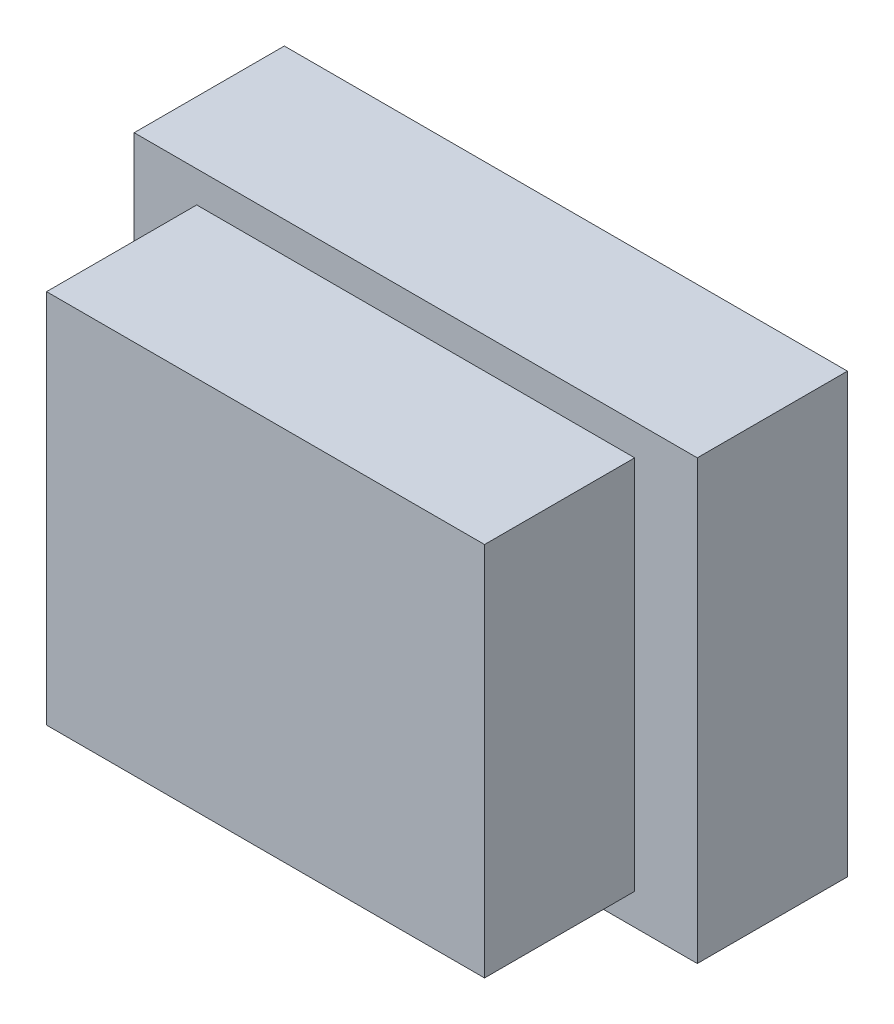
ISO-10303-21;
HEADER;
FILE_DESCRIPTION(('STEP AP214'),'2;1');
FILE_NAME('part.step','',(''),(''),'','','');
FILE_SCHEMA(('AUTOMOTIVE_DESIGN { 1 0 10303 214 1 1 1 1 }'));
ENDSEC;
DATA;
#1=APPLICATION_CONTEXT('core data for automotive mechanical design processes');
#2=APPLICATION_PROTOCOL_DEFINITION('international standard','automotive_design',2000,#1);
#3=PRODUCT_CONTEXT('',#1,'mechanical');
#4=PRODUCT('Part','Part','',(#3));
#5=PRODUCT_RELATED_PRODUCT_CATEGORY('part','',(#4));
#6=PRODUCT_DEFINITION_FORMATION('','',#4);
#7=PRODUCT_DEFINITION_CONTEXT('part definition',#1,'design');
#8=PRODUCT_DEFINITION('design','',#6,#7);
#9=PRODUCT_DEFINITION_SHAPE('','',#8);
#10=(LENGTH_UNIT() NAMED_UNIT(*) SI_UNIT(.MILLI.,.METRE.));
#11=(NAMED_UNIT(*) PLANE_ANGLE_UNIT() SI_UNIT($,.RADIAN.));
#12=(NAMED_UNIT(*) SI_UNIT($,.STERADIAN.) SOLID_ANGLE_UNIT());
#13=UNCERTAINTY_MEASURE_WITH_UNIT(LENGTH_MEASURE(1.E-05),#10,'distance_accuracy_value','');
#14=(GEOMETRIC_REPRESENTATION_CONTEXT(3) GLOBAL_UNCERTAINTY_ASSIGNED_CONTEXT((#13)) GLOBAL_UNIT_ASSIGNED_CONTEXT((#10,
#11,#12)) REPRESENTATION_CONTEXT('',''));
#15=CARTESIAN_POINT('',(0.,0.,0.));
#16=DIRECTION('',(0.,0.,1.));
#17=DIRECTION('',(1.,0.,0.));
#18=AXIS2_PLACEMENT_3D('',#15,#16,#17);
#19=CARTESIAN_POINT('',(-45.,35.,48.));
#20=DIRECTION('',(1.,0.,0.));
#21=DIRECTION('',(0.,0.,-1.));
#22=AXIS2_PLACEMENT_3D('',#19,#20,#21);
#23=PLANE('',#22);
#24=DIRECTION('',(0.,-1.,0.));
#25=VECTOR('',#24,1.);
#26=CARTESIAN_POINT('',(-45.,35.,24.));
#27=LINE('',#26,#25);
#28=CARTESIAN_POINT('',(-45.,35.,24.));
#29=VERTEX_POINT('',#28);
#30=CARTESIAN_POINT('',(-45.,-35.,24.));
#31=VERTEX_POINT('',#30);
#32=EDGE_CURVE('E148',#29,#31,#27,.T.);
#33=ORIENTED_EDGE('',*,*,#32,.F.);
#34=DIRECTION('',(0.,0.,-1.));
#35=VECTOR('',#34,1.);
#36=CARTESIAN_POINT('',(-45.,35.,48.));
#37=LINE('',#36,#35);
#38=CARTESIAN_POINT('',(-45.,35.,0.));
#39=VERTEX_POINT('',#38);
#40=EDGE_CURVE('E162',#29,#39,#37,.T.);
#41=ORIENTED_EDGE('',*,*,#40,.T.);
#42=DIRECTION('',(0.,-1.,0.));
#43=VECTOR('',#42,1.);
#44=CARTESIAN_POINT('',(-45.,35.,0.));
#45=LINE('',#44,#43);
#46=CARTESIAN_POINT('',(-45.,-35.,0.));
#47=VERTEX_POINT('',#46);
#48=EDGE_CURVE('E150',#39,#47,#45,.T.);
#49=ORIENTED_EDGE('',*,*,#48,.T.);
#50=DIRECTION('',(0.,0.,-1.));
#51=VECTOR('',#50,1.);
#52=CARTESIAN_POINT('',(-45.,-35.,48.));
#53=LINE('',#52,#51);
#54=EDGE_CURVE('E49',#31,#47,#53,.T.);
#55=ORIENTED_EDGE('',*,*,#54,.F.);
#56=EDGE_LOOP('',(#33,#41,#49,#55));
#57=FACE_BOUND('',#56,.T.);
#58=ADVANCED_FACE('F42',(#57),#23,.F.);
#59=CARTESIAN_POINT('',(-45.,-35.,48.));
#60=DIRECTION('',(0.,1.,0.));
#61=DIRECTION('',(0.,0.,1.));
#62=AXIS2_PLACEMENT_3D('',#59,#60,#61);
#63=PLANE('',#62);
#64=DIRECTION('',(1.,0.,0.));
#65=VECTOR('',#64,1.);
#66=CARTESIAN_POINT('',(-45.,-35.,24.));
#67=LINE('',#66,#65);
#68=CARTESIAN_POINT('',(45.,-35.,24.));
#69=VERTEX_POINT('',#68);
#70=EDGE_CURVE('E146',#31,#69,#67,.T.);
#71=ORIENTED_EDGE('',*,*,#70,.F.);
#72=ORIENTED_EDGE('',*,*,#54,.T.);
#73=DIRECTION('',(1.,0.,0.));
#74=VECTOR('',#73,1.);
#75=CARTESIAN_POINT('',(-45.,-35.,0.));
#76=LINE('',#75,#74);
#77=CARTESIAN_POINT('',(45.,-35.,0.));
#78=VERTEX_POINT('',#77);
#79=EDGE_CURVE('E153',#47,#78,#76,.T.);
#80=ORIENTED_EDGE('',*,*,#79,.T.);
#81=DIRECTION('',(0.,0.,-1.));
#82=VECTOR('',#81,1.);
#83=CARTESIAN_POINT('',(45.,-35.,48.));
#84=LINE('',#83,#82);
#85=EDGE_CURVE('E166',#69,#78,#84,.T.);
#86=ORIENTED_EDGE('',*,*,#85,.F.);
#87=EDGE_LOOP('',(#71,#72,#80,#86));
#88=FACE_BOUND('',#87,.T.);
#89=ADVANCED_FACE('F171',(#88),#63,.F.);
#90=CARTESIAN_POINT('',(45.,-35.,48.));
#91=DIRECTION('',(-1.,0.,0.));
#92=DIRECTION('',(0.,0.,1.));
#93=AXIS2_PLACEMENT_3D('',#90,#91,#92);
#94=PLANE('',#93);
#95=DIRECTION('',(0.,1.,0.));
#96=VECTOR('',#95,1.);
#97=CARTESIAN_POINT('',(45.,-35.,24.));
#98=LINE('',#97,#96);
#99=CARTESIAN_POINT('',(45.,35.,24.));
#100=VERTEX_POINT('',#99);
#101=EDGE_CURVE('E55',#69,#100,#98,.T.);
#102=ORIENTED_EDGE('',*,*,#101,.F.);
#103=ORIENTED_EDGE('',*,*,#85,.T.);
#104=DIRECTION('',(0.,1.,0.));
#105=VECTOR('',#104,1.);
#106=CARTESIAN_POINT('',(45.,-35.,0.));
#107=LINE('',#106,#105);
#108=CARTESIAN_POINT('',(45.,35.,0.));
#109=VERTEX_POINT('',#108);
#110=EDGE_CURVE('E156',#78,#109,#107,.T.);
#111=ORIENTED_EDGE('',*,*,#110,.T.);
#112=DIRECTION('',(0.,0.,-1.));
#113=VECTOR('',#112,1.);
#114=CARTESIAN_POINT('',(45.,35.,48.));
#115=LINE('',#114,#113);
#116=EDGE_CURVE('E164',#100,#109,#115,.T.);
#117=ORIENTED_EDGE('',*,*,#116,.F.);
#118=EDGE_LOOP('',(#102,#103,#111,#117));
#119=FACE_BOUND('',#118,.T.);
#120=ADVANCED_FACE('F185',(#119),#94,.F.);
#121=CARTESIAN_POINT('',(45.,35.,48.));
#122=DIRECTION('',(0.,-1.,0.));
#123=DIRECTION('',(0.,0.,-1.));
#124=AXIS2_PLACEMENT_3D('',#121,#122,#123);
#125=PLANE('',#124);
#126=DIRECTION('',(-1.,0.,0.));
#127=VECTOR('',#126,1.);
#128=CARTESIAN_POINT('',(45.,35.,24.));
#129=LINE('',#128,#127);
#130=EDGE_CURVE('E12',#100,#29,#129,.T.);
#131=ORIENTED_EDGE('',*,*,#130,.F.);
#132=ORIENTED_EDGE('',*,*,#116,.T.);
#133=DIRECTION('',(-1.,0.,0.));
#134=VECTOR('',#133,1.);
#135=CARTESIAN_POINT('',(45.,35.,0.));
#136=LINE('',#135,#134);
#137=EDGE_CURVE('E159',#109,#39,#136,.T.);
#138=ORIENTED_EDGE('',*,*,#137,.T.);
#139=ORIENTED_EDGE('',*,*,#40,.F.);
#140=EDGE_LOOP('',(#131,#132,#138,#139));
#141=FACE_BOUND('',#140,.T.);
#142=ADVANCED_FACE('F182',(#141),#125,.F.);
#143=CARTESIAN_POINT('',(0.,0.,0.));
#144=DIRECTION('',(0.,0.,1.));
#145=DIRECTION('',(1.,0.,0.));
#146=AXIS2_PLACEMENT_3D('',#143,#144,#145);
#147=PLANE('',#146);
#148=ORIENTED_EDGE('',*,*,#48,.F.);
#149=ORIENTED_EDGE('',*,*,#137,.F.);
#150=ORIENTED_EDGE('',*,*,#110,.F.);
#151=ORIENTED_EDGE('',*,*,#79,.F.);
#152=EDGE_LOOP('',(#148,#149,#150,#151));
#153=FACE_BOUND('',#152,.T.);
#154=ADVANCED_FACE('F178',(#153),#147,.F.);
#155=CARTESIAN_POINT('',(0.,0.,24.));
#156=DIRECTION('',(0.,0.,1.));
#157=DIRECTION('',(1.,0.,0.));
#158=AXIS2_PLACEMENT_3D('',#155,#156,#157);
#159=PLANE('',#158);
#160=DIRECTION('',(-1.,0.,0.));
#161=VECTOR('',#160,1.);
#162=CARTESIAN_POINT('',(35.,30.,24.));
#163=LINE('',#162,#161);
#164=CARTESIAN_POINT('',(35.,30.,24.));
#165=VERTEX_POINT('',#164);
#166=CARTESIAN_POINT('',(-35.,30.,24.));
#167=VERTEX_POINT('',#166);
#168=EDGE_CURVE('E117',#165,#167,#163,.T.);
#169=ORIENTED_EDGE('',*,*,#168,.F.);
#170=DIRECTION('',(0.,1.,0.));
#171=VECTOR('',#170,1.);
#172=CARTESIAN_POINT('',(35.,-30.,24.));
#173=LINE('',#172,#171);
#174=CARTESIAN_POINT('',(35.,-30.,24.));
#175=VERTEX_POINT('',#174);
#176=EDGE_CURVE('E126',#175,#165,#173,.T.);
#177=ORIENTED_EDGE('',*,*,#176,.F.);
#178=DIRECTION('',(1.,0.,0.));
#179=VECTOR('',#178,1.);
#180=CARTESIAN_POINT('',(-35.,-30.,24.));
#181=LINE('',#180,#179);
#182=CARTESIAN_POINT('',(-35.,-30.,24.));
#183=VERTEX_POINT('',#182);
#184=EDGE_CURVE('E109',#183,#175,#181,.T.);
#185=ORIENTED_EDGE('',*,*,#184,.F.);
#186=DIRECTION('',(0.,-1.,0.));
#187=VECTOR('',#186,1.);
#188=CARTESIAN_POINT('',(-35.,30.,24.));
#189=LINE('',#188,#187);
#190=EDGE_CURVE('E123',#167,#183,#189,.T.);
#191=ORIENTED_EDGE('',*,*,#190,.F.);
#192=EDGE_LOOP('',(#169,#177,#185,#191));
#193=FACE_BOUND('',#192,.T.);
#194=ORIENTED_EDGE('',*,*,#32,.T.);
#195=ORIENTED_EDGE('',*,*,#70,.T.);
#196=ORIENTED_EDGE('',*,*,#101,.T.);
#197=ORIENTED_EDGE('',*,*,#130,.T.);
#198=EDGE_LOOP('',(#194,#195,#196,#197));
#199=FACE_BOUND('',#198,.T.);
#200=ADVANCED_FACE('F122',(#193,#199),#159,.T.);
#201=CARTESIAN_POINT('',(-35.,30.,24.));
#202=DIRECTION('',(-1.,0.,0.));
#203=DIRECTION('',(0.,0.,1.));
#204=AXIS2_PLACEMENT_3D('',#201,#202,#203);
#205=PLANE('',#204);
#206=DIRECTION('',(0.,-1.,0.));
#207=VECTOR('',#206,1.);
#208=CARTESIAN_POINT('',(-35.,30.,48.));
#209=LINE('',#208,#207);
#210=CARTESIAN_POINT('',(-35.,30.,48.));
#211=VERTEX_POINT('',#210);
#212=CARTESIAN_POINT('',(-35.,-30.,48.));
#213=VERTEX_POINT('',#212);
#214=EDGE_CURVE('E137',#211,#213,#209,.T.);
#215=ORIENTED_EDGE('',*,*,#214,.F.);
#216=DIRECTION('',(0.,0.,1.));
#217=VECTOR('',#216,1.);
#218=CARTESIAN_POINT('',(-35.,30.,24.));
#219=LINE('',#218,#217);
#220=EDGE_CURVE('E129',#167,#211,#219,.T.);
#221=ORIENTED_EDGE('',*,*,#220,.F.);
#222=ORIENTED_EDGE('',*,*,#190,.T.);
#223=DIRECTION('',(0.,0.,1.));
#224=VECTOR('',#223,1.);
#225=CARTESIAN_POINT('',(-35.,-30.,24.));
#226=LINE('',#225,#224);
#227=EDGE_CURVE('E106',#183,#213,#226,.T.);
#228=ORIENTED_EDGE('',*,*,#227,.T.);
#229=EDGE_LOOP('',(#215,#221,#222,#228));
#230=FACE_BOUND('',#229,.T.);
#231=ADVANCED_FACE('F128',(#230),#205,.T.);
#232=CARTESIAN_POINT('',(35.,30.,24.));
#233=DIRECTION('',(0.,1.,0.));
#234=DIRECTION('',(0.,0.,1.));
#235=AXIS2_PLACEMENT_3D('',#232,#233,#234);
#236=PLANE('',#235);
#237=DIRECTION('',(-1.,0.,0.));
#238=VECTOR('',#237,1.);
#239=CARTESIAN_POINT('',(35.,30.,48.));
#240=LINE('',#239,#238);
#241=CARTESIAN_POINT('',(35.,30.,48.));
#242=VERTEX_POINT('',#241);
#243=EDGE_CURVE('E130',#242,#211,#240,.T.);
#244=ORIENTED_EDGE('',*,*,#243,.F.);
#245=DIRECTION('',(0.,0.,1.));
#246=VECTOR('',#245,1.);
#247=CARTESIAN_POINT('',(35.,30.,24.));
#248=LINE('',#247,#246);
#249=EDGE_CURVE('E142',#165,#242,#248,.T.);
#250=ORIENTED_EDGE('',*,*,#249,.F.);
#251=ORIENTED_EDGE('',*,*,#168,.T.);
#252=ORIENTED_EDGE('',*,*,#220,.T.);
#253=EDGE_LOOP('',(#244,#250,#251,#252));
#254=FACE_BOUND('',#253,.T.);
#255=ADVANCED_FACE('F239',(#254),#236,.T.);
#256=CARTESIAN_POINT('',(35.,-30.,24.));
#257=DIRECTION('',(1.,0.,0.));
#258=DIRECTION('',(0.,0.,-1.));
#259=AXIS2_PLACEMENT_3D('',#256,#257,#258);
#260=PLANE('',#259);
#261=DIRECTION('',(0.,1.,0.));
#262=VECTOR('',#261,1.);
#263=CARTESIAN_POINT('',(35.,-30.,48.));
#264=LINE('',#263,#262);
#265=CARTESIAN_POINT('',(35.,-30.,48.));
#266=VERTEX_POINT('',#265);
#267=EDGE_CURVE('E63',#266,#242,#264,.T.);
#268=ORIENTED_EDGE('',*,*,#267,.F.);
#269=DIRECTION('',(0.,0.,1.));
#270=VECTOR('',#269,1.);
#271=CARTESIAN_POINT('',(35.,-30.,24.));
#272=LINE('',#271,#270);
#273=EDGE_CURVE('E116',#175,#266,#272,.T.);
#274=ORIENTED_EDGE('',*,*,#273,.F.);
#275=ORIENTED_EDGE('',*,*,#176,.T.);
#276=ORIENTED_EDGE('',*,*,#249,.T.);
#277=EDGE_LOOP('',(#268,#274,#275,#276));
#278=FACE_BOUND('',#277,.T.);
#279=ADVANCED_FACE('F241',(#278),#260,.T.);
#280=CARTESIAN_POINT('',(-35.,-30.,24.));
#281=DIRECTION('',(0.,-1.,0.));
#282=DIRECTION('',(0.,0.,-1.));
#283=AXIS2_PLACEMENT_3D('',#280,#281,#282);
#284=PLANE('',#283);
#285=DIRECTION('',(1.,0.,0.));
#286=VECTOR('',#285,1.);
#287=CARTESIAN_POINT('',(-35.,-30.,48.));
#288=LINE('',#287,#286);
#289=EDGE_CURVE('E111',#213,#266,#288,.T.);
#290=ORIENTED_EDGE('',*,*,#289,.F.);
#291=ORIENTED_EDGE('',*,*,#227,.F.);
#292=ORIENTED_EDGE('',*,*,#184,.T.);
#293=ORIENTED_EDGE('',*,*,#273,.T.);
#294=EDGE_LOOP('',(#290,#291,#292,#293));
#295=FACE_BOUND('',#294,.T.);
#296=ADVANCED_FACE('F108',(#295),#284,.T.);
#297=CARTESIAN_POINT('',(0.,0.,48.));
#298=DIRECTION('',(0.,0.,1.));
#299=DIRECTION('',(1.,0.,0.));
#300=AXIS2_PLACEMENT_3D('',#297,#298,#299);
#301=PLANE('',#300);
#302=ORIENTED_EDGE('',*,*,#243,.T.);
#303=ORIENTED_EDGE('',*,*,#214,.T.);
#304=ORIENTED_EDGE('',*,*,#289,.T.);
#305=ORIENTED_EDGE('',*,*,#267,.T.);
#306=EDGE_LOOP('',(#302,#303,#304,#305));
#307=FACE_BOUND('',#306,.T.);
#308=ADVANCED_FACE('F221',(#307),#301,.T.);
#309=CLOSED_SHELL('',(#58,#89,#120,#142,#154,#200,#231,#255,#279,#296,#308));
#310=MANIFOLD_SOLID_BREP('B2',#309);
#311=ADVANCED_BREP_SHAPE_REPRESENTATION('',(#18,#310),#14);
#312=SHAPE_DEFINITION_REPRESENTATION(#9,#311);
ENDSEC;
END-ISO-10303-21;
